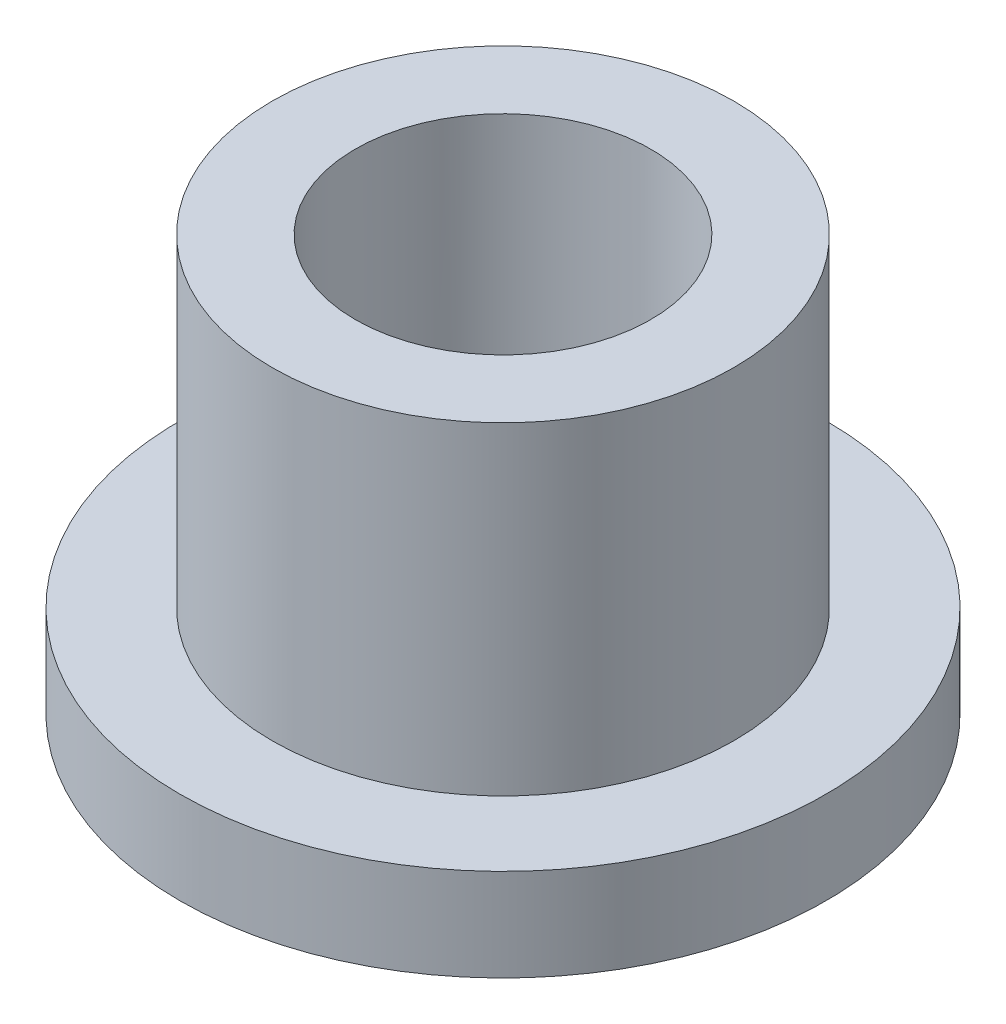
ISO-10303-21;
HEADER;
FILE_DESCRIPTION(('STEP AP214'),'2;1');
FILE_NAME('part.step','',(''),(''),'','','');
FILE_SCHEMA(('AUTOMOTIVE_DESIGN { 1 0 10303 214 1 1 1 1 }'));
ENDSEC;
DATA;
#1=APPLICATION_CONTEXT('core data for automotive mechanical design processes');
#2=APPLICATION_PROTOCOL_DEFINITION('international standard','automotive_design',2000,#1);
#3=PRODUCT_CONTEXT('',#1,'mechanical');
#4=PRODUCT('Part','Part','',(#3));
#5=PRODUCT_RELATED_PRODUCT_CATEGORY('part','',(#4));
#6=PRODUCT_DEFINITION_FORMATION('','',#4);
#7=PRODUCT_DEFINITION_CONTEXT('part definition',#1,'design');
#8=PRODUCT_DEFINITION('design','',#6,#7);
#9=PRODUCT_DEFINITION_SHAPE('','',#8);
#10=(LENGTH_UNIT() NAMED_UNIT(*) SI_UNIT(.MILLI.,.METRE.));
#11=(NAMED_UNIT(*) PLANE_ANGLE_UNIT() SI_UNIT($,.RADIAN.));
#12=(NAMED_UNIT(*) SI_UNIT($,.STERADIAN.) SOLID_ANGLE_UNIT());
#13=UNCERTAINTY_MEASURE_WITH_UNIT(LENGTH_MEASURE(1.E-05),#10,'distance_accuracy_value','');
#14=(GEOMETRIC_REPRESENTATION_CONTEXT(3) GLOBAL_UNCERTAINTY_ASSIGNED_CONTEXT((#13)) GLOBAL_UNIT_ASSIGNED_CONTEXT((#10,
#11,#12)) REPRESENTATION_CONTEXT('',''));
#15=CARTESIAN_POINT('',(0.,0.,0.));
#16=DIRECTION('',(0.,0.,1.));
#17=DIRECTION('',(1.,0.,0.));
#18=AXIS2_PLACEMENT_3D('',#15,#16,#17);
#19=CARTESIAN_POINT('',(0.,-0.919999999999999,0.));
#20=DIRECTION('',(0.,1.,0.));
#21=DIRECTION('',(0.,0.,1.));
#22=AXIS2_PLACEMENT_3D('',#19,#20,#21);
#23=CYLINDRICAL_SURFACE('',#22,1.6);
#24=CARTESIAN_POINT('',(0.,4.5,0.));
#25=DIRECTION('',(0.,1.,0.));
#26=DIRECTION('',(0.,0.,1.));
#27=AXIS2_PLACEMENT_3D('',#24,#25,#26);
#28=CIRCLE('',#27,1.6);
#29=CARTESIAN_POINT('',(0.,4.5,1.6));
#30=VERTEX_POINT('',#29);
#31=EDGE_CURVE('E10',#30,#30,#28,.T.);
#32=ORIENTED_EDGE('',*,*,#31,.T.);
#33=EDGE_LOOP('',(#32));
#34=FACE_BOUND('',#33,.T.);
#35=CARTESIAN_POINT('',(0.,0.5,0.));
#36=DIRECTION('',(0.,-1.,0.));
#37=DIRECTION('',(0.,0.,-1.));
#38=AXIS2_PLACEMENT_3D('',#35,#36,#37);
#39=CIRCLE('',#38,1.6);
#40=CARTESIAN_POINT('',(0.,0.5,-1.6));
#41=VERTEX_POINT('',#40);
#42=EDGE_CURVE('E35',#41,#41,#39,.F.);
#43=ORIENTED_EDGE('',*,*,#42,.F.);
#44=EDGE_LOOP('',(#43));
#45=FACE_BOUND('',#44,.T.);
#46=ADVANCED_FACE('F31',(#34,#45),#23,.F.);
#47=CARTESIAN_POINT('',(3.5,0.,0.));
#48=DIRECTION('',(0.,1.,0.));
#49=DIRECTION('',(0.,0.,1.));
#50=AXIS2_PLACEMENT_3D('',#47,#48,#49);
#51=PLANE('',#50);
#52=CARTESIAN_POINT('',(0.,0.,0.));
#53=DIRECTION('',(0.,-1.,0.));
#54=DIRECTION('',(0.,0.,-1.));
#55=AXIS2_PLACEMENT_3D('',#52,#53,#54);
#56=CIRCLE('',#55,2.5);
#57=CARTESIAN_POINT('',(0.,0.,-2.5));
#58=VERTEX_POINT('',#57);
#59=EDGE_CURVE('E54',#58,#58,#56,.T.);
#60=ORIENTED_EDGE('',*,*,#59,.F.);
#61=EDGE_LOOP('',(#60));
#62=FACE_BOUND('',#61,.T.);
#63=CARTESIAN_POINT('',(0.,0.,0.));
#64=DIRECTION('',(0.,1.,0.));
#65=DIRECTION('',(0.,0.,1.));
#66=AXIS2_PLACEMENT_3D('',#63,#64,#65);
#67=CIRCLE('',#66,3.5);
#68=CARTESIAN_POINT('',(0.,0.,3.5));
#69=VERTEX_POINT('',#68);
#70=EDGE_CURVE('E51',#69,#69,#67,.T.);
#71=ORIENTED_EDGE('',*,*,#70,.F.);
#72=EDGE_LOOP('',(#71));
#73=FACE_BOUND('',#72,.T.);
#74=ADVANCED_FACE('F33',(#62,#73),#51,.F.);
#75=CARTESIAN_POINT('',(1.6,4.5,0.));
#76=DIRECTION('',(0.,-1.,0.));
#77=DIRECTION('',(0.,0.,-1.));
#78=AXIS2_PLACEMENT_3D('',#75,#76,#77);
#79=PLANE('',#78);
#80=ORIENTED_EDGE('',*,*,#31,.F.);
#81=EDGE_LOOP('',(#80));
#82=FACE_BOUND('',#81,.T.);
#83=CARTESIAN_POINT('',(0.,4.5,0.));
#84=DIRECTION('',(0.,1.,0.));
#85=DIRECTION('',(0.,0.,1.));
#86=AXIS2_PLACEMENT_3D('',#83,#84,#85);
#87=CIRCLE('',#86,2.5);
#88=CARTESIAN_POINT('',(0.,4.5,2.5));
#89=VERTEX_POINT('',#88);
#90=EDGE_CURVE('E39',#89,#89,#87,.T.);
#91=ORIENTED_EDGE('',*,*,#90,.T.);
#92=EDGE_LOOP('',(#91));
#93=FACE_BOUND('',#92,.T.);
#94=ADVANCED_FACE('F70',(#82,#93),#79,.F.);
#95=CARTESIAN_POINT('',(0.,-0.919999999999999,0.));
#96=DIRECTION('',(0.,1.,0.));
#97=DIRECTION('',(0.,0.,1.));
#98=AXIS2_PLACEMENT_3D('',#95,#96,#97);
#99=CYLINDRICAL_SURFACE('',#98,2.5);
#100=ORIENTED_EDGE('',*,*,#90,.F.);
#101=EDGE_LOOP('',(#100));
#102=FACE_BOUND('',#101,.T.);
#103=CARTESIAN_POINT('',(0.,1.,0.));
#104=DIRECTION('',(0.,1.,0.));
#105=DIRECTION('',(0.,0.,1.));
#106=AXIS2_PLACEMENT_3D('',#103,#104,#105);
#107=CIRCLE('',#106,2.5);
#108=CARTESIAN_POINT('',(0.,1.,2.5));
#109=VERTEX_POINT('',#108);
#110=EDGE_CURVE('E43',#109,#109,#107,.T.);
#111=ORIENTED_EDGE('',*,*,#110,.T.);
#112=EDGE_LOOP('',(#111));
#113=FACE_BOUND('',#112,.T.);
#114=ADVANCED_FACE('F75',(#102,#113),#99,.T.);
#115=CARTESIAN_POINT('',(2.5,1.,0.));
#116=DIRECTION('',(0.,-1.,0.));
#117=DIRECTION('',(0.,0.,-1.));
#118=AXIS2_PLACEMENT_3D('',#115,#116,#117);
#119=PLANE('',#118);
#120=ORIENTED_EDGE('',*,*,#110,.F.);
#121=EDGE_LOOP('',(#120));
#122=FACE_BOUND('',#121,.T.);
#123=CARTESIAN_POINT('',(0.,1.,0.));
#124=DIRECTION('',(0.,1.,0.));
#125=DIRECTION('',(0.,0.,1.));
#126=AXIS2_PLACEMENT_3D('',#123,#124,#125);
#127=CIRCLE('',#126,3.5);
#128=CARTESIAN_POINT('',(0.,1.,3.5));
#129=VERTEX_POINT('',#128);
#130=EDGE_CURVE('E48',#129,#129,#127,.T.);
#131=ORIENTED_EDGE('',*,*,#130,.T.);
#132=EDGE_LOOP('',(#131));
#133=FACE_BOUND('',#132,.T.);
#134=ADVANCED_FACE('F79',(#122,#133),#119,.F.);
#135=CARTESIAN_POINT('',(0.,-0.919999999999999,0.));
#136=DIRECTION('',(0.,1.,0.));
#137=DIRECTION('',(0.,0.,1.));
#138=AXIS2_PLACEMENT_3D('',#135,#136,#137);
#139=CYLINDRICAL_SURFACE('',#138,3.5);
#140=ORIENTED_EDGE('',*,*,#130,.F.);
#141=EDGE_LOOP('',(#140));
#142=FACE_BOUND('',#141,.T.);
#143=ORIENTED_EDGE('',*,*,#70,.T.);
#144=EDGE_LOOP('',(#143));
#145=FACE_BOUND('',#144,.T.);
#146=ADVANCED_FACE('F83',(#142,#145),#139,.T.);
#147=CARTESIAN_POINT('',(0.,0.5,0.));
#148=DIRECTION('',(0.,-1.,0.));
#149=DIRECTION('',(0.,0.,-1.));
#150=AXIS2_PLACEMENT_3D('',#147,#148,#149);
#151=PLANE('',#150);
#152=CARTESIAN_POINT('',(0.,0.5,0.));
#153=DIRECTION('',(0.,-1.,0.));
#154=DIRECTION('',(0.,0.,-1.));
#155=AXIS2_PLACEMENT_3D('',#152,#153,#154);
#156=CIRCLE('',#155,2.5);
#157=CARTESIAN_POINT('',(0.,0.5,-2.5));
#158=VERTEX_POINT('',#157);
#159=EDGE_CURVE('E57',#158,#158,#156,.T.);
#160=ORIENTED_EDGE('',*,*,#159,.T.);
#161=EDGE_LOOP('',(#160));
#162=FACE_BOUND('',#161,.T.);
#163=ORIENTED_EDGE('',*,*,#42,.T.);
#164=EDGE_LOOP('',(#163));
#165=FACE_BOUND('',#164,.T.);
#166=ADVANCED_FACE('F64',(#162,#165),#151,.T.);
#167=CARTESIAN_POINT('',(0.,0.5,0.));
#168=DIRECTION('',(0.,-1.,0.));
#169=DIRECTION('',(0.,0.,-1.));
#170=AXIS2_PLACEMENT_3D('',#167,#168,#169);
#171=CYLINDRICAL_SURFACE('',#170,2.5);
#172=ORIENTED_EDGE('',*,*,#159,.F.);
#173=EDGE_LOOP('',(#172));
#174=FACE_BOUND('',#173,.T.);
#175=ORIENTED_EDGE('',*,*,#59,.T.);
#176=EDGE_LOOP('',(#175));
#177=FACE_BOUND('',#176,.T.);
#178=ADVANCED_FACE('F88',(#174,#177),#171,.F.);
#179=CLOSED_SHELL('',(#46,#74,#94,#114,#134,#146,#166,#178));
#180=MANIFOLD_SOLID_BREP('B2',#179);
#181=ADVANCED_BREP_SHAPE_REPRESENTATION('',(#18,#180),#14);
#182=SHAPE_DEFINITION_REPRESENTATION(#9,#181);
ENDSEC;
END-ISO-10303-21;
